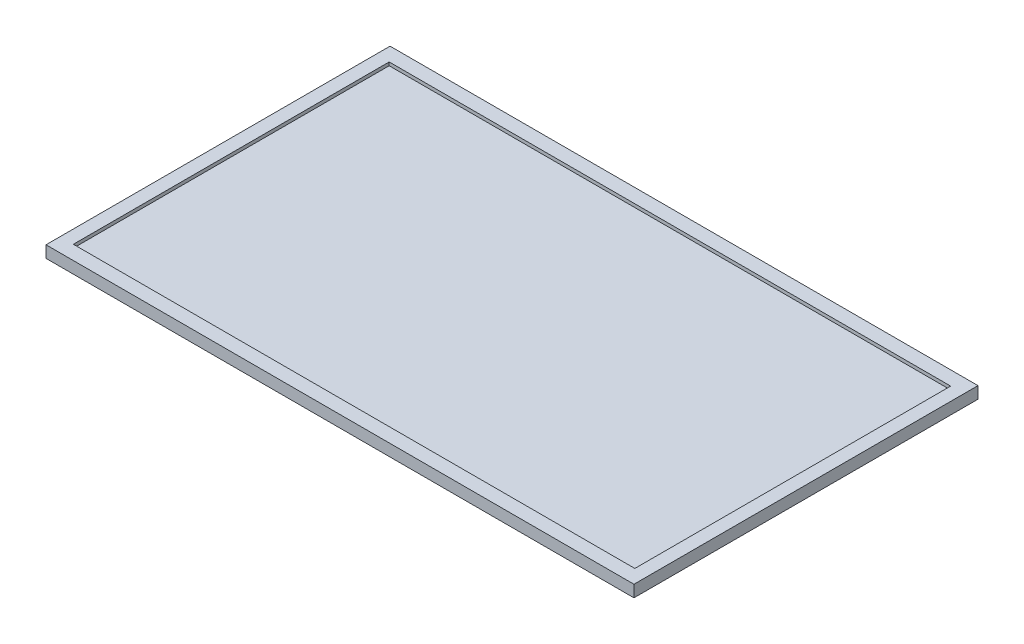
ISO-10303-21;
HEADER;
FILE_DESCRIPTION(('STEP AP214'),'2;1');
FILE_NAME('part.step','',(''),(''),'','','');
FILE_SCHEMA(('AUTOMOTIVE_DESIGN { 1 0 10303 214 1 1 1 1 }'));
ENDSEC;
DATA;
#1=APPLICATION_CONTEXT('core data for automotive mechanical design processes');
#2=APPLICATION_PROTOCOL_DEFINITION('international standard','automotive_design',2000,#1);
#3=PRODUCT_CONTEXT('',#1,'mechanical');
#4=PRODUCT('Part','Part','',(#3));
#5=PRODUCT_RELATED_PRODUCT_CATEGORY('part','',(#4));
#6=PRODUCT_DEFINITION_FORMATION('','',#4);
#7=PRODUCT_DEFINITION_CONTEXT('part definition',#1,'design');
#8=PRODUCT_DEFINITION('design','',#6,#7);
#9=PRODUCT_DEFINITION_SHAPE('','',#8);
#10=(LENGTH_UNIT() NAMED_UNIT(*) SI_UNIT(.MILLI.,.METRE.));
#11=(NAMED_UNIT(*) PLANE_ANGLE_UNIT() SI_UNIT($,.RADIAN.));
#12=(NAMED_UNIT(*) SI_UNIT($,.STERADIAN.) SOLID_ANGLE_UNIT());
#13=UNCERTAINTY_MEASURE_WITH_UNIT(LENGTH_MEASURE(1.E-05),#10,'distance_accuracy_value','');
#14=(GEOMETRIC_REPRESENTATION_CONTEXT(3) GLOBAL_UNCERTAINTY_ASSIGNED_CONTEXT((#13)) GLOBAL_UNIT_ASSIGNED_CONTEXT((#10,
#11,#12)) REPRESENTATION_CONTEXT('',''));
#15=CARTESIAN_POINT('',(0.,0.,0.));
#16=DIRECTION('',(0.,0.,1.));
#17=DIRECTION('',(1.,0.,0.));
#18=AXIS2_PLACEMENT_3D('',#15,#16,#17);
#19=CARTESIAN_POINT('',(0.,10.7,0.));
#20=DIRECTION('',(1.,0.,0.));
#21=DIRECTION('',(0.,0.,-1.));
#22=AXIS2_PLACEMENT_3D('',#19,#20,#21);
#23=PLANE('',#22);
#24=DIRECTION('',(0.,0.,1.));
#25=VECTOR('',#24,1.);
#26=CARTESIAN_POINT('',(0.,0.,0.));
#27=LINE('',#26,#25);
#28=CARTESIAN_POINT('',(0.,0.,-312.));
#29=VERTEX_POINT('',#28);
#30=CARTESIAN_POINT('',(0.,0.,0.));
#31=VERTEX_POINT('',#30);
#32=EDGE_CURVE('E158',#29,#31,#27,.T.);
#33=ORIENTED_EDGE('',*,*,#32,.T.);
#34=DIRECTION('',(0.,-1.,0.));
#35=VECTOR('',#34,1.);
#36=CARTESIAN_POINT('',(0.,10.7,0.));
#37=LINE('',#36,#35);
#38=CARTESIAN_POINT('',(0.,10.7,0.));
#39=VERTEX_POINT('',#38);
#40=EDGE_CURVE('E11',#39,#31,#37,.T.);
#41=ORIENTED_EDGE('',*,*,#40,.F.);
#42=DIRECTION('',(0.,0.,1.));
#43=VECTOR('',#42,1.);
#44=CARTESIAN_POINT('',(0.,10.7,0.));
#45=LINE('',#44,#43);
#46=CARTESIAN_POINT('',(0.,10.7,-312.));
#47=VERTEX_POINT('',#46);
#48=EDGE_CURVE('E164',#47,#39,#45,.T.);
#49=ORIENTED_EDGE('',*,*,#48,.F.);
#50=DIRECTION('',(0.,-1.,0.));
#51=VECTOR('',#50,1.);
#52=CARTESIAN_POINT('',(0.,10.7,-312.));
#53=LINE('',#52,#51);
#54=EDGE_CURVE('E174',#47,#29,#53,.T.);
#55=ORIENTED_EDGE('',*,*,#54,.T.);
#56=EDGE_LOOP('',(#33,#41,#49,#55));
#57=FACE_BOUND('',#56,.T.);
#58=ADVANCED_FACE('F39',(#57),#23,.F.);
#59=CARTESIAN_POINT('',(0.,10.7,0.));
#60=DIRECTION('',(0.,0.,-1.));
#61=DIRECTION('',(-1.,0.,0.));
#62=AXIS2_PLACEMENT_3D('',#59,#60,#61);
#63=PLANE('',#62);
#64=DIRECTION('',(1.,0.,0.));
#65=VECTOR('',#64,1.);
#66=CARTESIAN_POINT('',(0.,0.,0.));
#67=LINE('',#66,#65);
#68=CARTESIAN_POINT('',(533.2,0.,0.));
#69=VERTEX_POINT('',#68);
#70=EDGE_CURVE('E178',#31,#69,#67,.T.);
#71=ORIENTED_EDGE('',*,*,#70,.T.);
#72=DIRECTION('',(0.,-1.,0.));
#73=VECTOR('',#72,1.);
#74=CARTESIAN_POINT('',(533.2,10.7,0.));
#75=LINE('',#74,#73);
#76=CARTESIAN_POINT('',(533.2,10.7,0.));
#77=VERTEX_POINT('',#76);
#78=EDGE_CURVE('E47',#77,#69,#75,.T.);
#79=ORIENTED_EDGE('',*,*,#78,.F.);
#80=DIRECTION('',(1.,0.,0.));
#81=VECTOR('',#80,1.);
#82=CARTESIAN_POINT('',(0.,10.7,0.));
#83=LINE('',#82,#81);
#84=EDGE_CURVE('E91',#39,#77,#83,.T.);
#85=ORIENTED_EDGE('',*,*,#84,.F.);
#86=ORIENTED_EDGE('',*,*,#40,.T.);
#87=EDGE_LOOP('',(#71,#79,#85,#86));
#88=FACE_BOUND('',#87,.T.);
#89=ADVANCED_FACE('F213',(#88),#63,.F.);
#90=CARTESIAN_POINT('',(533.2,10.7,0.));
#91=DIRECTION('',(-1.,0.,0.));
#92=DIRECTION('',(0.,0.,1.));
#93=AXIS2_PLACEMENT_3D('',#90,#91,#92);
#94=PLANE('',#93);
#95=DIRECTION('',(0.,0.,-1.));
#96=VECTOR('',#95,1.);
#97=CARTESIAN_POINT('',(533.2,0.,0.));
#98=LINE('',#97,#96);
#99=CARTESIAN_POINT('',(533.2,0.,-312.));
#100=VERTEX_POINT('',#99);
#101=EDGE_CURVE('E181',#69,#100,#98,.T.);
#102=ORIENTED_EDGE('',*,*,#101,.T.);
#103=DIRECTION('',(0.,-1.,0.));
#104=VECTOR('',#103,1.);
#105=CARTESIAN_POINT('',(533.2,10.7,-312.));
#106=LINE('',#105,#104);
#107=CARTESIAN_POINT('',(533.2,10.7,-312.));
#108=VERTEX_POINT('',#107);
#109=EDGE_CURVE('E188',#108,#100,#106,.T.);
#110=ORIENTED_EDGE('',*,*,#109,.F.);
#111=DIRECTION('',(0.,0.,-1.));
#112=VECTOR('',#111,1.);
#113=CARTESIAN_POINT('',(533.2,10.7,0.));
#114=LINE('',#113,#112);
#115=EDGE_CURVE('E169',#77,#108,#114,.T.);
#116=ORIENTED_EDGE('',*,*,#115,.F.);
#117=ORIENTED_EDGE('',*,*,#78,.T.);
#118=EDGE_LOOP('',(#102,#110,#116,#117));
#119=FACE_BOUND('',#118,.T.);
#120=ADVANCED_FACE('F195',(#119),#94,.F.);
#121=CARTESIAN_POINT('',(0.,10.7,-312.));
#122=DIRECTION('',(0.,0.,1.));
#123=DIRECTION('',(1.,0.,0.));
#124=AXIS2_PLACEMENT_3D('',#121,#122,#123);
#125=PLANE('',#124);
#126=DIRECTION('',(-1.,0.,0.));
#127=VECTOR('',#126,1.);
#128=CARTESIAN_POINT('',(0.,0.,-312.));
#129=LINE('',#128,#127);
#130=EDGE_CURVE('E84',#100,#29,#129,.T.);
#131=ORIENTED_EDGE('',*,*,#130,.T.);
#132=ORIENTED_EDGE('',*,*,#54,.F.);
#133=DIRECTION('',(-1.,0.,0.));
#134=VECTOR('',#133,1.);
#135=CARTESIAN_POINT('',(0.,10.7,-312.));
#136=LINE('',#135,#134);
#137=EDGE_CURVE('E63',#108,#47,#136,.T.);
#138=ORIENTED_EDGE('',*,*,#137,.F.);
#139=ORIENTED_EDGE('',*,*,#109,.T.);
#140=EDGE_LOOP('',(#131,#132,#138,#139));
#141=FACE_BOUND('',#140,.T.);
#142=ADVANCED_FACE('F203',(#141),#125,.F.);
#143=CARTESIAN_POINT('',(0.,10.7,0.));
#144=DIRECTION('',(0.,-1.,0.));
#145=DIRECTION('',(0.,0.,-1.));
#146=AXIS2_PLACEMENT_3D('',#143,#144,#145);
#147=PLANE('',#146);
#148=DIRECTION('',(1.,0.,0.));
#149=VECTOR('',#148,1.);
#150=CARTESIAN_POINT('',(12.0079999999999,10.7,-12.792));
#151=LINE('',#150,#149);
#152=CARTESIAN_POINT('',(12.0079999999999,10.7,-12.792));
#153=VERTEX_POINT('',#152);
#154=CARTESIAN_POINT('',(521.192,10.7,-12.7919999999999));
#155=VERTEX_POINT('',#154);
#156=EDGE_CURVE('E149',#153,#155,#151,.T.);
#157=ORIENTED_EDGE('',*,*,#156,.F.);
#158=DIRECTION('',(0.,0.,1.));
#159=VECTOR('',#158,1.);
#160=CARTESIAN_POINT('',(12.0079999999999,10.7,-299.208));
#161=LINE('',#160,#159);
#162=CARTESIAN_POINT('',(12.0079999999999,10.7,-299.208));
#163=VERTEX_POINT('',#162);
#164=EDGE_CURVE('E54',#163,#153,#161,.T.);
#165=ORIENTED_EDGE('',*,*,#164,.F.);
#166=DIRECTION('',(-1.,0.,0.));
#167=VECTOR('',#166,1.);
#168=CARTESIAN_POINT('',(12.0079999999999,10.7,-299.208));
#169=LINE('',#168,#167);
#170=CARTESIAN_POINT('',(521.192,10.7,-299.208));
#171=VERTEX_POINT('',#170);
#172=EDGE_CURVE('E136',#171,#163,#169,.T.);
#173=ORIENTED_EDGE('',*,*,#172,.F.);
#174=DIRECTION('',(0.,0.,-1.));
#175=VECTOR('',#174,1.);
#176=CARTESIAN_POINT('',(521.192,10.7,-299.208));
#177=LINE('',#176,#175);
#178=EDGE_CURVE('E140',#155,#171,#177,.T.);
#179=ORIENTED_EDGE('',*,*,#178,.F.);
#180=EDGE_LOOP('',(#157,#165,#173,#179));
#181=FACE_BOUND('',#180,.T.);
#182=ORIENTED_EDGE('',*,*,#48,.T.);
#183=ORIENTED_EDGE('',*,*,#84,.T.);
#184=ORIENTED_EDGE('',*,*,#115,.T.);
#185=ORIENTED_EDGE('',*,*,#137,.T.);
#186=EDGE_LOOP('',(#182,#183,#184,#185));
#187=FACE_BOUND('',#186,.T.);
#188=ADVANCED_FACE('F205',(#181,#187),#147,.F.);
#189=CARTESIAN_POINT('',(0.,0.,0.));
#190=DIRECTION('',(0.,-1.,0.));
#191=DIRECTION('',(0.,0.,-1.));
#192=AXIS2_PLACEMENT_3D('',#189,#190,#191);
#193=PLANE('',#192);
#194=ORIENTED_EDGE('',*,*,#32,.F.);
#195=ORIENTED_EDGE('',*,*,#130,.F.);
#196=ORIENTED_EDGE('',*,*,#101,.F.);
#197=ORIENTED_EDGE('',*,*,#70,.F.);
#198=EDGE_LOOP('',(#194,#195,#196,#197));
#199=FACE_BOUND('',#198,.T.);
#200=ADVANCED_FACE('F199',(#199),#193,.T.);
#201=CARTESIAN_POINT('',(12.0079999999999,7.7,-299.208));
#202=DIRECTION('',(-1.,0.,0.));
#203=DIRECTION('',(0.,0.,1.));
#204=AXIS2_PLACEMENT_3D('',#201,#202,#203);
#205=PLANE('',#204);
#206=ORIENTED_EDGE('',*,*,#164,.T.);
#207=DIRECTION('',(0.,1.,0.));
#208=VECTOR('',#207,1.);
#209=CARTESIAN_POINT('',(12.0079999999999,7.7,-12.792));
#210=LINE('',#209,#208);
#211=CARTESIAN_POINT('',(12.0079999999999,7.7,-12.792));
#212=VERTEX_POINT('',#211);
#213=EDGE_CURVE('E111',#212,#153,#210,.T.);
#214=ORIENTED_EDGE('',*,*,#213,.F.);
#215=DIRECTION('',(0.,0.,1.));
#216=VECTOR('',#215,1.);
#217=CARTESIAN_POINT('',(12.0079999999999,7.7,-299.208));
#218=LINE('',#217,#216);
#219=CARTESIAN_POINT('',(12.0079999999999,7.7,-299.208));
#220=VERTEX_POINT('',#219);
#221=EDGE_CURVE('E115',#220,#212,#218,.T.);
#222=ORIENTED_EDGE('',*,*,#221,.F.);
#223=DIRECTION('',(0.,1.,0.));
#224=VECTOR('',#223,1.);
#225=CARTESIAN_POINT('',(12.0079999999999,7.7,-299.208));
#226=LINE('',#225,#224);
#227=EDGE_CURVE('E155',#220,#163,#226,.T.);
#228=ORIENTED_EDGE('',*,*,#227,.T.);
#229=EDGE_LOOP('',(#206,#214,#222,#228));
#230=FACE_BOUND('',#229,.T.);
#231=ADVANCED_FACE('F113',(#230),#205,.F.);
#232=CARTESIAN_POINT('',(12.0079999999999,7.7,-299.208));
#233=DIRECTION('',(0.,0.,-1.));
#234=DIRECTION('',(-1.,0.,0.));
#235=AXIS2_PLACEMENT_3D('',#232,#233,#234);
#236=PLANE('',#235);
#237=ORIENTED_EDGE('',*,*,#172,.T.);
#238=ORIENTED_EDGE('',*,*,#227,.F.);
#239=DIRECTION('',(-1.,0.,0.));
#240=VECTOR('',#239,1.);
#241=CARTESIAN_POINT('',(12.0079999999999,7.7,-299.208));
#242=LINE('',#241,#240);
#243=CARTESIAN_POINT('',(521.192,7.7,-299.208));
#244=VERTEX_POINT('',#243);
#245=EDGE_CURVE('E122',#244,#220,#242,.T.);
#246=ORIENTED_EDGE('',*,*,#245,.F.);
#247=DIRECTION('',(0.,1.,0.));
#248=VECTOR('',#247,1.);
#249=CARTESIAN_POINT('',(521.192,7.7,-299.208));
#250=LINE('',#249,#248);
#251=EDGE_CURVE('E159',#244,#171,#250,.T.);
#252=ORIENTED_EDGE('',*,*,#251,.T.);
#253=EDGE_LOOP('',(#237,#238,#246,#252));
#254=FACE_BOUND('',#253,.T.);
#255=ADVANCED_FACE('F252',(#254),#236,.F.);
#256=CARTESIAN_POINT('',(521.192,7.7,-299.208));
#257=DIRECTION('',(1.,0.,0.));
#258=DIRECTION('',(0.,0.,-1.));
#259=AXIS2_PLACEMENT_3D('',#256,#257,#258);
#260=PLANE('',#259);
#261=ORIENTED_EDGE('',*,*,#178,.T.);
#262=ORIENTED_EDGE('',*,*,#251,.F.);
#263=DIRECTION('',(0.,0.,-1.));
#264=VECTOR('',#263,1.);
#265=CARTESIAN_POINT('',(521.192,7.7,-299.208));
#266=LINE('',#265,#264);
#267=CARTESIAN_POINT('',(521.192,7.7,-12.7919999999999));
#268=VERTEX_POINT('',#267);
#269=EDGE_CURVE('E131',#268,#244,#266,.T.);
#270=ORIENTED_EDGE('',*,*,#269,.F.);
#271=DIRECTION('',(0.,1.,0.));
#272=VECTOR('',#271,1.);
#273=CARTESIAN_POINT('',(521.192,7.7,-12.7919999999999));
#274=LINE('',#273,#272);
#275=EDGE_CURVE('E121',#268,#155,#274,.T.);
#276=ORIENTED_EDGE('',*,*,#275,.T.);
#277=EDGE_LOOP('',(#261,#262,#270,#276));
#278=FACE_BOUND('',#277,.T.);
#279=ADVANCED_FACE('F261',(#278),#260,.F.);
#280=CARTESIAN_POINT('',(12.0079999999999,7.7,-12.792));
#281=DIRECTION('',(0.,0.,1.));
#282=DIRECTION('',(1.,0.,0.));
#283=AXIS2_PLACEMENT_3D('',#280,#281,#282);
#284=PLANE('',#283);
#285=ORIENTED_EDGE('',*,*,#156,.T.);
#286=ORIENTED_EDGE('',*,*,#275,.F.);
#287=DIRECTION('',(1.,0.,0.));
#288=VECTOR('',#287,1.);
#289=CARTESIAN_POINT('',(12.0079999999999,7.7,-12.792));
#290=LINE('',#289,#288);
#291=EDGE_CURVE('E125',#212,#268,#290,.T.);
#292=ORIENTED_EDGE('',*,*,#291,.F.);
#293=ORIENTED_EDGE('',*,*,#213,.T.);
#294=EDGE_LOOP('',(#285,#286,#292,#293));
#295=FACE_BOUND('',#294,.T.);
#296=ADVANCED_FACE('F126',(#295),#284,.F.);
#297=CARTESIAN_POINT('',(0.,7.7,0.));
#298=DIRECTION('',(0.,1.,0.));
#299=DIRECTION('',(0.,0.,1.));
#300=AXIS2_PLACEMENT_3D('',#297,#298,#299);
#301=PLANE('',#300);
#302=ORIENTED_EDGE('',*,*,#221,.T.);
#303=ORIENTED_EDGE('',*,*,#291,.T.);
#304=ORIENTED_EDGE('',*,*,#269,.T.);
#305=ORIENTED_EDGE('',*,*,#245,.T.);
#306=EDGE_LOOP('',(#302,#303,#304,#305));
#307=FACE_BOUND('',#306,.T.);
#308=ADVANCED_FACE('F133',(#307),#301,.T.);
#309=CLOSED_SHELL('',(#58,#89,#120,#142,#188,#200,#231,#255,#279,#296,#308));
#310=MANIFOLD_SOLID_BREP('B2',#309);
#311=ADVANCED_BREP_SHAPE_REPRESENTATION('',(#18,#310),#14);
#312=SHAPE_DEFINITION_REPRESENTATION(#9,#311);
ENDSEC;
END-ISO-10303-21;
